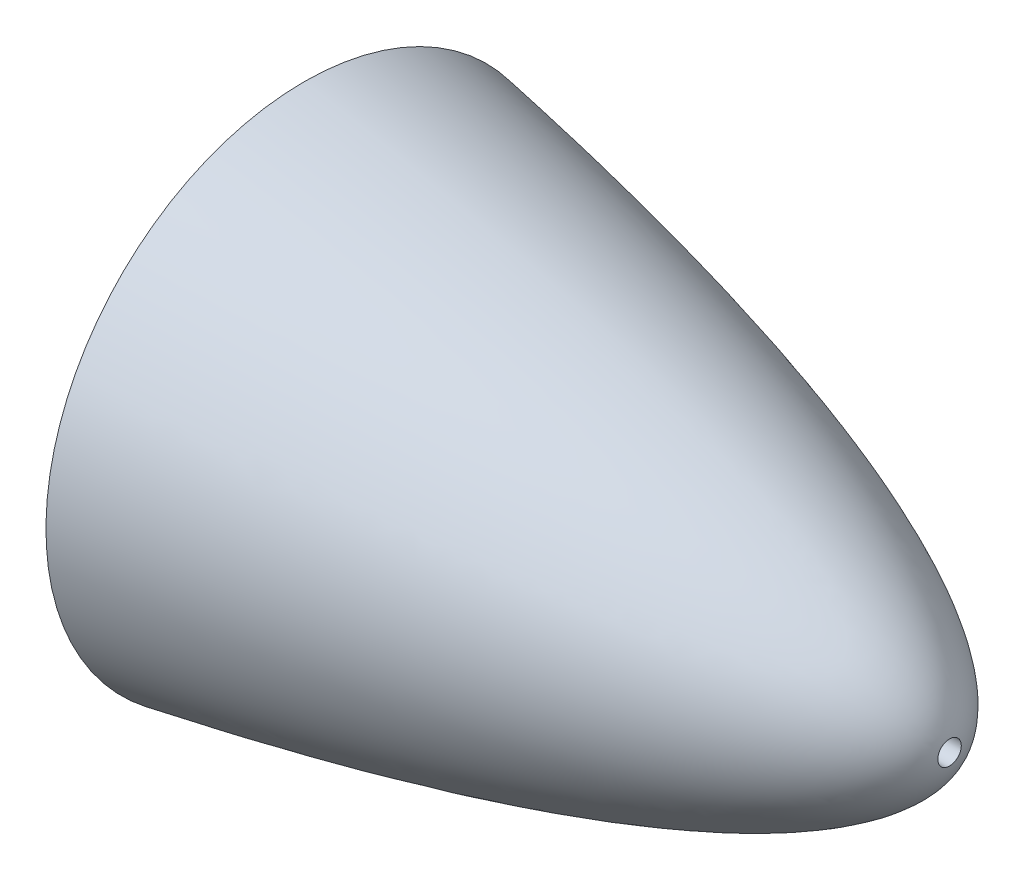
ISO-10303-21;
HEADER;
FILE_DESCRIPTION(('STEP AP214'),'2;1');
FILE_NAME('part.step','',(''),(''),'','','');
FILE_SCHEMA(('AUTOMOTIVE_DESIGN { 1 0 10303 214 1 1 1 1 }'));
ENDSEC;
DATA;
#1=APPLICATION_CONTEXT('core data for automotive mechanical design processes');
#2=APPLICATION_PROTOCOL_DEFINITION('international standard','automotive_design',2000,#1);
#3=PRODUCT_CONTEXT('',#1,'mechanical');
#4=PRODUCT('Part','Part','',(#3));
#5=PRODUCT_RELATED_PRODUCT_CATEGORY('part','',(#4));
#6=PRODUCT_DEFINITION_FORMATION('','',#4);
#7=PRODUCT_DEFINITION_CONTEXT('part definition',#1,'design');
#8=PRODUCT_DEFINITION('design','',#6,#7);
#9=PRODUCT_DEFINITION_SHAPE('','',#8);
#10=(LENGTH_UNIT() NAMED_UNIT(*) SI_UNIT(.MILLI.,.METRE.));
#11=(NAMED_UNIT(*) PLANE_ANGLE_UNIT() SI_UNIT($,.RADIAN.));
#12=(NAMED_UNIT(*) SI_UNIT($,.STERADIAN.) SOLID_ANGLE_UNIT());
#13=UNCERTAINTY_MEASURE_WITH_UNIT(LENGTH_MEASURE(1.E-05),#10,'distance_accuracy_value','');
#14=(GEOMETRIC_REPRESENTATION_CONTEXT(3) GLOBAL_UNCERTAINTY_ASSIGNED_CONTEXT((#13)) GLOBAL_UNIT_ASSIGNED_CONTEXT((#10,
#11,#12)) REPRESENTATION_CONTEXT('',''));
#15=CARTESIAN_POINT('',(0.,0.,0.));
#16=DIRECTION('',(0.,0.,1.));
#17=DIRECTION('',(1.,0.,0.));
#18=AXIS2_PLACEMENT_3D('',#15,#16,#17);
#19=CARTESIAN_POINT('',(131.041604602779,0.,0.));
#20=DIRECTION('',(1.,0.,0.));
#21=DIRECTION('',(0.,-0.381849318686593,0.924224592736303));
#22=AXIS2_PLACEMENT_3D('',#19,#20,#21);
#23=CONICAL_SURFACE('',#22,0.,0.0151854304327564);
#24=CARTESIAN_POINT('',(141.889137702371,0.,0.));
#25=DIRECTION('',(1.,0.,0.));
#26=DIRECTION('',(0.,0.,-1.));
#27=AXIS2_PLACEMENT_3D('',#24,#25,#26);
#28=CIRCLE('',#27,0.164737122090607);
#29=CARTESIAN_POINT('',(141.889137702371,-0.0629047578326724,0.152254099572742));
#30=VERTEX_POINT('',#29);
#31=EDGE_CURVE('E46',#30,#30,#28,.T.);
#32=CARTESIAN_POINT('',(196.889137702371,0.,0.));
#33=DIRECTION('',(1.,0.,0.));
#34=DIRECTION('',(0.,-0.381849318686593,0.924224592736303));
#35=AXIS2_PLACEMENT_3D('',#32,#33,#34);
#36=CIRCLE('',#35,0.999999999999999);
#37=CARTESIAN_POINT('',(196.889137702371,-0.38184931868657,0.924224592736302));
#38=VERTEX_POINT('',#37);
#39=EDGE_CURVE('E11',#38,#38,#36,.T.);
#40=CARTESIAN_POINT('',(141.889137702371,-0.0629047578326724,0.152254099572742));
#41=CARTESIAN_POINT('',(142.462054369038,-0.0662270970082338,0.160295458876529));
#42=CARTESIAN_POINT('',(143.034971035705,-0.0695494361837952,0.168336818180316));
#43=CARTESIAN_POINT('',(144.180804369038,-0.0761941145349181,0.18441953678789));
#44=CARTESIAN_POINT('',(144.753721035705,-0.0795164537104796,0.192460896091677));
#45=CARTESIAN_POINT('',(145.899554369038,-0.0861611320616024,0.208543614699252));
#46=CARTESIAN_POINT('',(146.472471035705,-0.0894834712371639,0.216584974003039));
#47=CARTESIAN_POINT('',(147.618304369038,-0.0961281495882867,0.232667692610613));
#48=CARTESIAN_POINT('',(148.191221035705,-0.0994504887638482,0.2407090519144));
#49=CARTESIAN_POINT('',(149.337054369038,-0.106095167114971,0.256791770521974));
#50=CARTESIAN_POINT('',(149.909971035705,-0.109417506290532,0.264833129825761));
#51=CARTESIAN_POINT('',(151.055804369038,-0.116062184641655,0.280915848433335));
#52=CARTESIAN_POINT('',(151.628721035705,-0.119384523817217,0.288957207737122));
#53=CARTESIAN_POINT('',(152.774554369038,-0.12602920216834,0.305039926344697));
#54=CARTESIAN_POINT('',(153.347471035705,-0.129351541343901,0.313081285648484));
#55=CARTESIAN_POINT('',(154.493304369038,-0.135996219695024,0.329164004256058));
#56=CARTESIAN_POINT('',(155.066221035705,-0.139318558870585,0.337205363559845));
#57=CARTESIAN_POINT('',(156.212054369038,-0.145963237221708,0.353288082167419));
#58=CARTESIAN_POINT('',(156.784971035705,-0.14928557639727,0.361329441471206));
#59=CARTESIAN_POINT('',(157.930804369038,-0.155930254748393,0.37741216007878));
#60=CARTESIAN_POINT('',(158.503721035705,-0.159252593923954,0.385453519382568));
#61=CARTESIAN_POINT('',(159.649554369038,-0.165897272275077,0.401536237990142));
#62=CARTESIAN_POINT('',(160.222471035705,-0.169219611450638,0.409577597293929));
#63=CARTESIAN_POINT('',(161.368304369038,-0.175864289801761,0.425660315901503));
#64=CARTESIAN_POINT('',(161.941221035705,-0.179186628977323,0.43370167520529));
#65=CARTESIAN_POINT('',(163.087054369038,-0.185831307328445,0.449784393812864));
#66=CARTESIAN_POINT('',(163.659971035705,-0.189153646504007,0.457825753116651));
#67=CARTESIAN_POINT('',(164.805804369038,-0.19579832485513,0.473908471724225));
#68=CARTESIAN_POINT('',(165.378721035705,-0.199120664030691,0.481949831028013));
#69=CARTESIAN_POINT('',(166.524554369038,-0.205765342381814,0.498032549635587));
#70=CARTESIAN_POINT('',(167.097471035705,-0.209087681557376,0.506073908939374));
#71=CARTESIAN_POINT('',(168.243304369038,-0.215732359908498,0.522156627546948));
#72=CARTESIAN_POINT('',(168.816221035705,-0.21905469908406,0.530197986850735));
#73=CARTESIAN_POINT('',(169.962054369038,-0.225699377435183,0.546280705458309));
#74=CARTESIAN_POINT('',(170.534971035705,-0.229021716610744,0.554322064762096));
#75=CARTESIAN_POINT('',(171.680804369038,-0.235666394961867,0.57040478336967));
#76=CARTESIAN_POINT('',(172.253721035705,-0.238988734137428,0.578446142673458));
#77=CARTESIAN_POINT('',(173.399554369038,-0.245633412488551,0.594528861281032));
#78=CARTESIAN_POINT('',(173.972471035705,-0.248955751664113,0.602570220584819));
#79=CARTESIAN_POINT('',(175.118304369038,-0.255600430015236,0.618652939192393));
#80=CARTESIAN_POINT('',(175.691221035705,-0.258922769190797,0.62669429849618));
#81=CARTESIAN_POINT('',(176.837054369038,-0.26556744754192,0.642777017103754));
#82=CARTESIAN_POINT('',(177.409971035705,-0.268889786717481,0.650818376407541));
#83=CARTESIAN_POINT('',(178.555804369038,-0.275534465068604,0.666901095015116));
#84=CARTESIAN_POINT('',(179.128721035705,-0.278856804244166,0.674942454318903));
#85=CARTESIAN_POINT('',(180.274554369038,-0.285501482595289,0.691025172926477));
#86=CARTESIAN_POINT('',(180.847471035705,-0.28882382177085,0.699066532230264));
#87=CARTESIAN_POINT('',(181.993304369038,-0.295468500121973,0.715149250837838));
#88=CARTESIAN_POINT('',(182.566221035705,-0.298790839297534,0.723190610141625));
#89=CARTESIAN_POINT('',(183.712054369038,-0.305435517648657,0.739273328749199));
#90=CARTESIAN_POINT('',(184.284971035705,-0.308757856824219,0.747314688052986));
#91=CARTESIAN_POINT('',(185.430804369038,-0.315402535175342,0.763397406660561));
#92=CARTESIAN_POINT('',(186.003721035705,-0.318724874350903,0.771438765964347));
#93=CARTESIAN_POINT('',(187.149554369038,-0.325369552702026,0.787521484571922));
#94=CARTESIAN_POINT('',(187.722471035705,-0.328691891877587,0.795562843875709));
#95=CARTESIAN_POINT('',(188.868304369038,-0.33533657022871,0.811645562483283));
#96=CARTESIAN_POINT('',(189.441221035705,-0.338658909404272,0.81968692178707));
#97=CARTESIAN_POINT('',(190.587054369038,-0.345303587755394,0.835769640394644));
#98=CARTESIAN_POINT('',(191.159971035705,-0.348625926930956,0.843810999698431));
#99=CARTESIAN_POINT('',(192.305804369038,-0.355270605282079,0.859893718306005));
#100=CARTESIAN_POINT('',(192.878721035705,-0.35859294445764,0.867935077609793));
#101=CARTESIAN_POINT('',(194.024554369038,-0.365237622808763,0.884017796217367));
#102=CARTESIAN_POINT('',(194.597471035705,-0.368559961984325,0.892059155521154));
#103=CARTESIAN_POINT('',(195.743304369038,-0.375204640335447,0.908141874128728));
#104=CARTESIAN_POINT('',(196.316221035705,-0.378526979511009,0.916183233432515));
#105=CARTESIAN_POINT('',(196.889137702371,-0.38184931868657,0.924224592736302));
#106=B_SPLINE_CURVE_WITH_KNOTS('',3,(#40,#41,#42,#43,#44,#45,#46,#47,#48,#49,#50,#51,#52,#53,
#54,#55,#56,#57,#58,#59,#60,#61,#62,#63,#64,#65,#66,#67,#68,#69,#70,#71,#72,#73,#74,#75,#76,#77,
#78,#79,#80,#81,#82,#83,#84,#85,#86,#87,#88,#89,#90,#91,#92,#93,#94,#95,#96,#97,#98,#99,#100,
#101,#102,#103,#104,#105),.UNSPECIFIED.,.F.,.F.,(4,2,2,2,2,2,2,2,2,2,2,2,2,2,2,2,2,2,2,2,2,2,2,
2,2,2,2,2,2,2,2,2,4),(0.,1.71894818859482,3.43789637718964,5.15684456578447,6.87579275437932,
8.59474094297414,10.313689131569,12.0326373201638,13.7515855087586,15.4705336973535,
17.1894818859483,18.9084300745432,20.627378263138,22.3463264517328,24.0652746403276,
25.7842228289225,27.5031710175173,29.2221192061121,30.941067394707,32.6600155833018,
34.3789637718966,36.0979119604915,37.8168601490863,39.5358083376811,41.254756526276,
42.9737047148708,44.6926529034656,46.4116010920605,48.1305492806553,49.8494974692501,
51.568445657845,53.2873938464398,55.0063420350346),.UNSPECIFIED.);
#107=EDGE_CURVE('BSEAM39',#30,#38,#106,.T.);
#108=ORIENTED_EDGE('',*,*,#31,.F.);
#109=ORIENTED_EDGE('',*,*,#39,.T.);
#110=ORIENTED_EDGE('',*,*,#107,.T.);
#111=ORIENTED_EDGE('',*,*,#107,.F.);
#112=EDGE_LOOP('',(#108,#110,#109,#111));
#113=FACE_BOUND('',#112,.T.);
#114=ADVANCED_FACE('F39',(#113),#23,.F.);
#115=CARTESIAN_POINT('',(196.889137702371,0.38184931868661,-0.92422459273629));
#116=CARTESIAN_POINT('',(196.839554646779,0.467401323798149,-1.13129388214593));
#117=CARTESIAN_POINT('',(196.712861191379,0.632079436727495,-1.52987927802463));
#118=CARTESIAN_POINT('',(196.3193895702,0.977481105307538,-2.36588631234866));
#119=CARTESIAN_POINT('',(195.561422824131,1.42196495152923,-3.44171094172106));
#120=CARTESIAN_POINT('',(194.195814099629,1.97498598195992,-4.78023797741789));
#121=CARTESIAN_POINT('',(191.760944394456,2.7245530416532,-6.59448322173679));
#122=CARTESIAN_POINT('',(187.575525249898,3.66763445751437,-8.87710884089327));
#123=CARTESIAN_POINT('',(180.794747040652,4.77629655175579,-11.5605044170772));
#124=CARTESIAN_POINT('',(172.335427863758,5.84446597779501,-14.1458919101075));
#125=CARTESIAN_POINT('',(158.935559837076,7.19734002797225,-17.4203758671545));
#126=CARTESIAN_POINT('',(138.447604758579,8.72733522879723,-21.1235622345802));
#127=CARTESIAN_POINT('',(108.795133883979,10.233973208226,-24.7702149973195));
#128=CARTESIAN_POINT('',(80.7714564782203,11.1682234873368,-27.0314658139897));
#129=CARTESIAN_POINT('',(56.9816445046968,11.7023572706603,-28.3242783298189));
#130=CARTESIAN_POINT('',(38.6162096677372,11.9928434006622,-29.0273682976627));
#131=CARTESIAN_POINT('',(19.9055777540228,12.1704827508016,-29.4573249533436));
#132=CARTESIAN_POINT('',(7.2902962043648,12.21260677694,-29.5592815603006));
#133=CARTESIAN_POINT('',(0.999987639771396,12.2144884476584,-29.5638359388691));
#134=B_SPLINE_CURVE_WITH_KNOTS('',3,(#115,#116,#117,#118,#119,#120,#121,#122,#123,#124,#125,
#126,#127,#128,#129,#130,#131,#132,#133),.UNSPECIFIED.,.F.,.F.,(4,1,1,1,1,1,1,1,1,1,1,1,1,1,1,1,
4),(-1.5657415453175,-1.54185273163209,-1.51796391794668,-1.47018629057586,-1.42240866320505,
-1.37463103583423,-1.2790757810926,-1.18352052635096,-1.08796527160933,-0.992410016867699,
-0.801299507384434,-0.610188997901168,-0.419078488417903,-0.323523233676271,-0.227967978934638,
-0.132412724193005,-0.0368574694513724),.UNSPECIFIED.);
#135=CARTESIAN_POINT('',(92.0000000000302,0.,0.));
#136=DIRECTION('',(1.,0.,0.));
#137=AXIS1_PLACEMENT('',#135,#136);
#138=SURFACE_OF_REVOLUTION('',#134,#137);
#139=CARTESIAN_POINT('',(141.889137702371,0.,0.));
#140=DIRECTION('',(1.,0.,0.));
#141=DIRECTION('',(0.,1.,0.));
#142=AXIS2_PLACEMENT_3D('',#139,#140,#141);
#143=CIRCLE('',#142,21.9983332379633);
#144=CARTESIAN_POINT('',(141.889137702371,21.9983332379633,0.));
#145=VERTEX_POINT('',#144);
#146=EDGE_CURVE('E42',#145,#145,#143,.F.);
#147=ORIENTED_EDGE('',*,*,#146,.F.);
#148=EDGE_LOOP('',(#147));
#149=FACE_BOUND('',#148,.T.);
#150=ORIENTED_EDGE('',*,*,#39,.F.);
#151=EDGE_LOOP('',(#150));
#152=FACE_BOUND('',#151,.T.);
#153=ADVANCED_FACE('F58',(#149,#152),#138,.F.);
#154=CARTESIAN_POINT('',(141.889137702371,0.,0.));
#155=DIRECTION('',(1.,0.,0.));
#156=DIRECTION('',(0.,0.,-1.));
#157=AXIS2_PLACEMENT_3D('',#154,#155,#156);
#158=PLANE('',#157);
#159=ORIENTED_EDGE('',*,*,#31,.T.);
#160=EDGE_LOOP('',(#159));
#161=FACE_BOUND('',#160,.T.);
#162=ORIENTED_EDGE('',*,*,#146,.T.);
#163=EDGE_LOOP('',(#162));
#164=FACE_BOUND('',#163,.T.);
#165=ADVANCED_FACE('F61',(#161,#164),#158,.F.);
#166=CLOSED_SHELL('',(#114,#153,#165));
#167=MANIFOLD_SOLID_BREP('B2',#166);
#168=ADVANCED_BREP_SHAPE_REPRESENTATION('',(#18,#167),#14);
#169=SHAPE_DEFINITION_REPRESENTATION(#9,#168);
ENDSEC;
END-ISO-10303-21;
